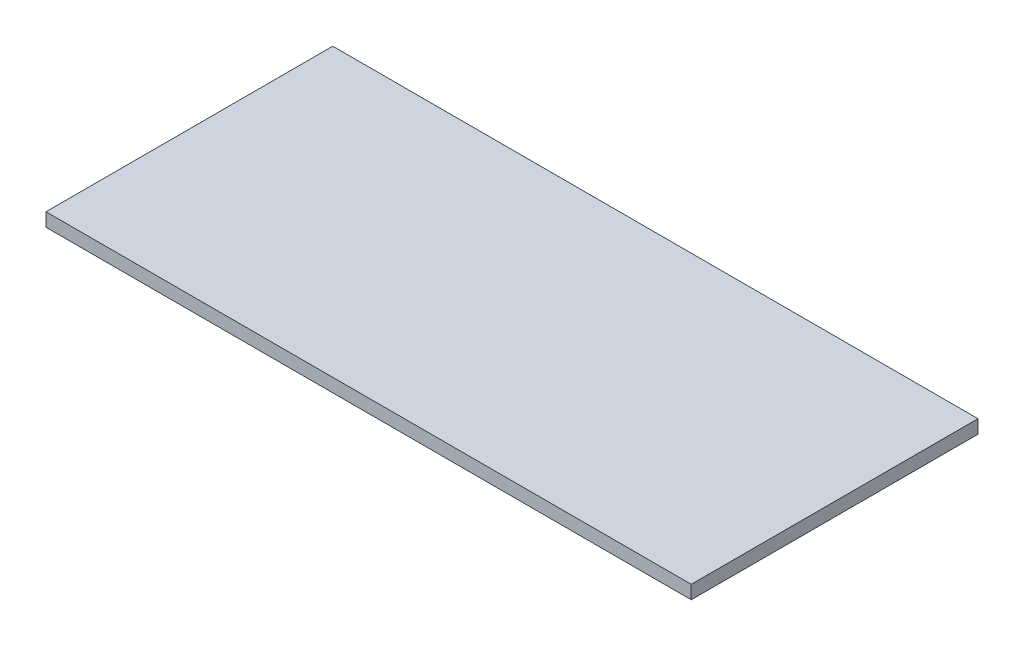
ISO-10303-21;
HEADER;
FILE_DESCRIPTION(('STEP AP214'),'2;1');
FILE_NAME('part.step','',(''),(''),'','','');
FILE_SCHEMA(('AUTOMOTIVE_DESIGN { 1 0 10303 214 1 1 1 1 }'));
ENDSEC;
DATA;
#1=APPLICATION_CONTEXT('core data for automotive mechanical design processes');
#2=APPLICATION_PROTOCOL_DEFINITION('international standard','automotive_design',2000,#1);
#3=PRODUCT_CONTEXT('',#1,'mechanical');
#4=PRODUCT('Part','Part','',(#3));
#5=PRODUCT_RELATED_PRODUCT_CATEGORY('part','',(#4));
#6=PRODUCT_DEFINITION_FORMATION('','',#4);
#7=PRODUCT_DEFINITION_CONTEXT('part definition',#1,'design');
#8=PRODUCT_DEFINITION('design','',#6,#7);
#9=PRODUCT_DEFINITION_SHAPE('','',#8);
#10=(LENGTH_UNIT() NAMED_UNIT(*) SI_UNIT(.MILLI.,.METRE.));
#11=(NAMED_UNIT(*) PLANE_ANGLE_UNIT() SI_UNIT($,.RADIAN.));
#12=(NAMED_UNIT(*) SI_UNIT($,.STERADIAN.) SOLID_ANGLE_UNIT());
#13=UNCERTAINTY_MEASURE_WITH_UNIT(LENGTH_MEASURE(1.E-05),#10,'distance_accuracy_value','');
#14=(GEOMETRIC_REPRESENTATION_CONTEXT(3) GLOBAL_UNCERTAINTY_ASSIGNED_CONTEXT((#13)) GLOBAL_UNIT_ASSIGNED_CONTEXT((#10,
#11,#12)) REPRESENTATION_CONTEXT('',''));
#15=CARTESIAN_POINT('',(0.,0.,0.));
#16=DIRECTION('',(0.,0.,1.));
#17=DIRECTION('',(1.,0.,0.));
#18=AXIS2_PLACEMENT_3D('',#15,#16,#17);
#19=CARTESIAN_POINT('',(0.,19.05,0.));
#20=DIRECTION('',(1.,0.,0.));
#21=DIRECTION('',(0.,0.,-1.));
#22=AXIS2_PLACEMENT_3D('',#19,#20,#21);
#23=PLANE('',#22);
#24=DIRECTION('',(0.,0.,1.));
#25=VECTOR('',#24,1.);
#26=CARTESIAN_POINT('',(0.,0.,0.));
#27=LINE('',#26,#25);
#28=CARTESIAN_POINT('',(-3.33066907387547E-13,0.,-406.4));
#29=VERTEX_POINT('',#28);
#30=CARTESIAN_POINT('',(0.,0.,0.));
#31=VERTEX_POINT('',#30);
#32=EDGE_CURVE('E115',#29,#31,#27,.T.);
#33=ORIENTED_EDGE('',*,*,#32,.T.);
#34=DIRECTION('',(0.,-1.,0.));
#35=VECTOR('',#34,1.);
#36=CARTESIAN_POINT('',(0.,19.05,0.));
#37=LINE('',#36,#35);
#38=CARTESIAN_POINT('',(0.,19.05,0.));
#39=VERTEX_POINT('',#38);
#40=EDGE_CURVE('E11',#39,#31,#37,.T.);
#41=ORIENTED_EDGE('',*,*,#40,.F.);
#42=DIRECTION('',(0.,0.,1.));
#43=VECTOR('',#42,1.);
#44=CARTESIAN_POINT('',(0.,19.05,0.));
#45=LINE('',#44,#43);
#46=CARTESIAN_POINT('',(-3.33066907387547E-13,19.05,-406.4));
#47=VERTEX_POINT('',#46);
#48=EDGE_CURVE('E99',#47,#39,#45,.T.);
#49=ORIENTED_EDGE('',*,*,#48,.F.);
#50=DIRECTION('',(0.,-1.,0.));
#51=VECTOR('',#50,1.);
#52=CARTESIAN_POINT('',(-3.33066907387547E-13,19.05,-406.4));
#53=LINE('',#52,#51);
#54=EDGE_CURVE('E111',#47,#29,#53,.T.);
#55=ORIENTED_EDGE('',*,*,#54,.T.);
#56=EDGE_LOOP('',(#33,#41,#49,#55));
#57=FACE_BOUND('',#56,.T.);
#58=ADVANCED_FACE('F47',(#57),#23,.F.);
#59=CARTESIAN_POINT('',(0.,19.05,0.));
#60=DIRECTION('',(0.,0.,-1.));
#61=DIRECTION('',(-1.,0.,0.));
#62=AXIS2_PLACEMENT_3D('',#59,#60,#61);
#63=PLANE('',#62);
#64=DIRECTION('',(1.,0.,0.));
#65=VECTOR('',#64,1.);
#66=CARTESIAN_POINT('',(0.,0.,0.));
#67=LINE('',#66,#65);
#68=CARTESIAN_POINT('',(914.4,0.,0.));
#69=VERTEX_POINT('',#68);
#70=EDGE_CURVE('E104',#31,#69,#67,.T.);
#71=ORIENTED_EDGE('',*,*,#70,.T.);
#72=DIRECTION('',(0.,-1.,0.));
#73=VECTOR('',#72,1.);
#74=CARTESIAN_POINT('',(914.4,19.05,0.));
#75=LINE('',#74,#73);
#76=CARTESIAN_POINT('',(914.4,19.05,0.));
#77=VERTEX_POINT('',#76);
#78=EDGE_CURVE('E56',#77,#69,#75,.T.);
#79=ORIENTED_EDGE('',*,*,#78,.F.);
#80=DIRECTION('',(1.,0.,0.));
#81=VECTOR('',#80,1.);
#82=CARTESIAN_POINT('',(0.,19.05,0.));
#83=LINE('',#82,#81);
#84=EDGE_CURVE('E94',#39,#77,#83,.T.);
#85=ORIENTED_EDGE('',*,*,#84,.F.);
#86=ORIENTED_EDGE('',*,*,#40,.T.);
#87=EDGE_LOOP('',(#71,#79,#85,#86));
#88=FACE_BOUND('',#87,.T.);
#89=ADVANCED_FACE('F103',(#88),#63,.F.);
#90=CARTESIAN_POINT('',(914.4,19.05,0.));
#91=DIRECTION('',(-1.,0.,0.));
#92=DIRECTION('',(0.,0.,1.));
#93=AXIS2_PLACEMENT_3D('',#90,#91,#92);
#94=PLANE('',#93);
#95=DIRECTION('',(0.,0.,-1.));
#96=VECTOR('',#95,1.);
#97=CARTESIAN_POINT('',(914.4,0.,0.));
#98=LINE('',#97,#96);
#99=CARTESIAN_POINT('',(914.4,0.,-406.4));
#100=VERTEX_POINT('',#99);
#101=EDGE_CURVE('E81',#69,#100,#98,.T.);
#102=ORIENTED_EDGE('',*,*,#101,.T.);
#103=DIRECTION('',(0.,-1.,0.));
#104=VECTOR('',#103,1.);
#105=CARTESIAN_POINT('',(914.4,19.05,-406.4));
#106=LINE('',#105,#104);
#107=CARTESIAN_POINT('',(914.4,19.05,-406.4));
#108=VERTEX_POINT('',#107);
#109=EDGE_CURVE('E106',#108,#100,#106,.T.);
#110=ORIENTED_EDGE('',*,*,#109,.F.);
#111=DIRECTION('',(0.,0.,-1.));
#112=VECTOR('',#111,1.);
#113=CARTESIAN_POINT('',(914.4,19.05,0.));
#114=LINE('',#113,#112);
#115=EDGE_CURVE('E97',#77,#108,#114,.T.);
#116=ORIENTED_EDGE('',*,*,#115,.F.);
#117=ORIENTED_EDGE('',*,*,#78,.T.);
#118=EDGE_LOOP('',(#102,#110,#116,#117));
#119=FACE_BOUND('',#118,.T.);
#120=ADVANCED_FACE('F107',(#119),#94,.F.);
#121=CARTESIAN_POINT('',(-3.33066907387547E-13,19.05,-406.4));
#122=DIRECTION('',(0.,0.,1.));
#123=DIRECTION('',(1.,0.,0.));
#124=AXIS2_PLACEMENT_3D('',#121,#122,#123);
#125=PLANE('',#124);
#126=DIRECTION('',(-1.,0.,0.));
#127=VECTOR('',#126,1.);
#128=CARTESIAN_POINT('',(-3.33066907387547E-13,0.,-406.4));
#129=LINE('',#128,#127);
#130=EDGE_CURVE('E87',#100,#29,#129,.T.);
#131=ORIENTED_EDGE('',*,*,#130,.T.);
#132=ORIENTED_EDGE('',*,*,#54,.F.);
#133=DIRECTION('',(-1.,0.,0.));
#134=VECTOR('',#133,1.);
#135=CARTESIAN_POINT('',(-3.33066907387547E-13,19.05,-406.4));
#136=LINE('',#135,#134);
#137=EDGE_CURVE('E64',#108,#47,#136,.T.);
#138=ORIENTED_EDGE('',*,*,#137,.F.);
#139=ORIENTED_EDGE('',*,*,#109,.T.);
#140=EDGE_LOOP('',(#131,#132,#138,#139));
#141=FACE_BOUND('',#140,.T.);
#142=ADVANCED_FACE('F128',(#141),#125,.F.);
#143=CARTESIAN_POINT('',(0.,19.05,0.));
#144=DIRECTION('',(0.,-1.,0.));
#145=DIRECTION('',(0.,0.,-1.));
#146=AXIS2_PLACEMENT_3D('',#143,#144,#145);
#147=PLANE('',#146);
#148=ORIENTED_EDGE('',*,*,#48,.T.);
#149=ORIENTED_EDGE('',*,*,#84,.T.);
#150=ORIENTED_EDGE('',*,*,#115,.T.);
#151=ORIENTED_EDGE('',*,*,#137,.T.);
#152=EDGE_LOOP('',(#148,#149,#150,#151));
#153=FACE_BOUND('',#152,.T.);
#154=ADVANCED_FACE('F95',(#153),#147,.F.);
#155=CARTESIAN_POINT('',(0.,0.,0.));
#156=DIRECTION('',(0.,-1.,0.));
#157=DIRECTION('',(0.,0.,-1.));
#158=AXIS2_PLACEMENT_3D('',#155,#156,#157);
#159=PLANE('',#158);
#160=ORIENTED_EDGE('',*,*,#32,.F.);
#161=ORIENTED_EDGE('',*,*,#130,.F.);
#162=ORIENTED_EDGE('',*,*,#101,.F.);
#163=ORIENTED_EDGE('',*,*,#70,.F.);
#164=EDGE_LOOP('',(#160,#161,#162,#163));
#165=FACE_BOUND('',#164,.T.);
#166=ADVANCED_FACE('F131',(#165),#159,.T.);
#167=CLOSED_SHELL('',(#58,#89,#120,#142,#154,#166));
#168=MANIFOLD_SOLID_BREP('B2',#167);
#169=ADVANCED_BREP_SHAPE_REPRESENTATION('',(#18,#168),#14);
#170=SHAPE_DEFINITION_REPRESENTATION(#9,#169);
ENDSEC;
END-ISO-10303-21;
